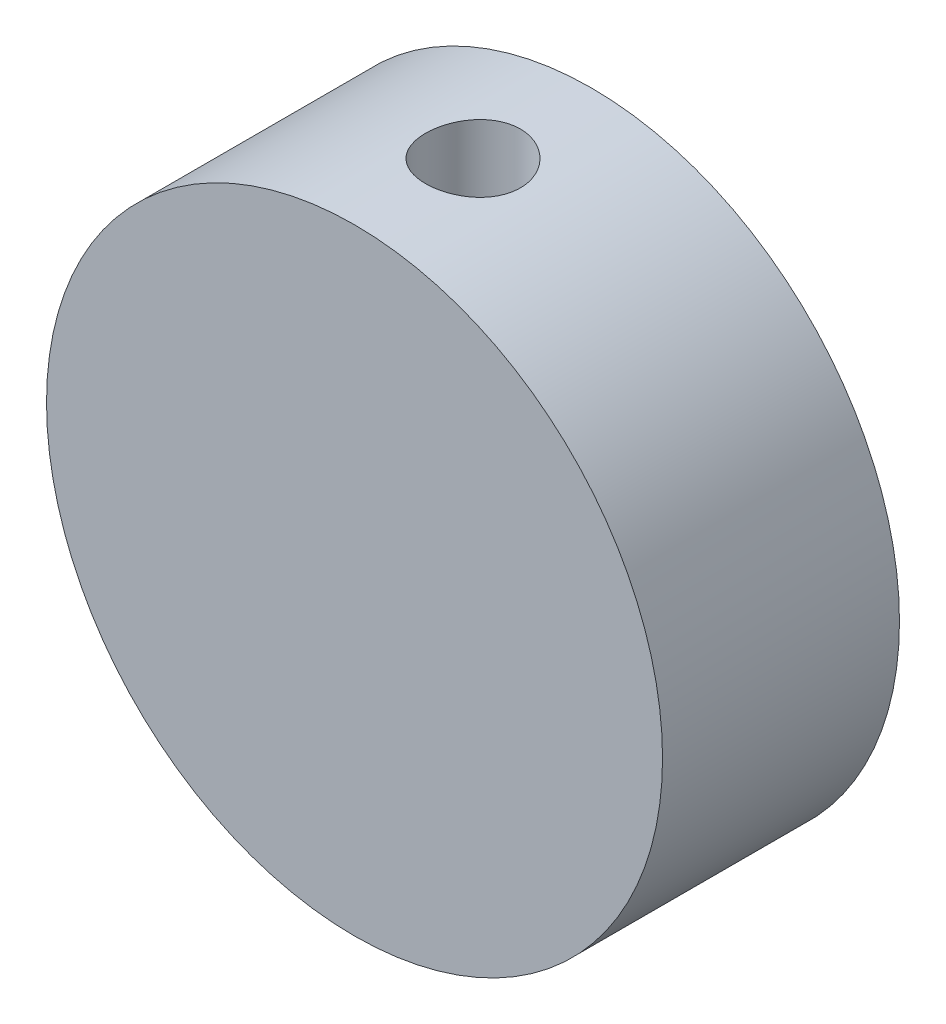
ISO-10303-21;
HEADER;
FILE_DESCRIPTION(('STEP AP214'),'2;1');
FILE_NAME('part.step','',(''),(''),'','','');
FILE_SCHEMA(('AUTOMOTIVE_DESIGN { 1 0 10303 214 1 1 1 1 }'));
ENDSEC;
DATA;
#1=APPLICATION_CONTEXT('core data for automotive mechanical design processes');
#2=APPLICATION_PROTOCOL_DEFINITION('international standard','automotive_design',2000,#1);
#3=PRODUCT_CONTEXT('',#1,'mechanical');
#4=PRODUCT('Part','Part','',(#3));
#5=PRODUCT_RELATED_PRODUCT_CATEGORY('part','',(#4));
#6=PRODUCT_DEFINITION_FORMATION('','',#4);
#7=PRODUCT_DEFINITION_CONTEXT('part definition',#1,'design');
#8=PRODUCT_DEFINITION('design','',#6,#7);
#9=PRODUCT_DEFINITION_SHAPE('','',#8);
#10=(LENGTH_UNIT() NAMED_UNIT(*) SI_UNIT(.MILLI.,.METRE.));
#11=(NAMED_UNIT(*) PLANE_ANGLE_UNIT() SI_UNIT($,.RADIAN.));
#12=(NAMED_UNIT(*) SI_UNIT($,.STERADIAN.) SOLID_ANGLE_UNIT());
#13=UNCERTAINTY_MEASURE_WITH_UNIT(LENGTH_MEASURE(1.E-05),#10,'distance_accuracy_value','');
#14=(GEOMETRIC_REPRESENTATION_CONTEXT(3) GLOBAL_UNCERTAINTY_ASSIGNED_CONTEXT((#13)) GLOBAL_UNIT_ASSIGNED_CONTEXT((#10,
#11,#12)) REPRESENTATION_CONTEXT('',''));
#15=CARTESIAN_POINT('',(0.,0.,0.));
#16=DIRECTION('',(0.,0.,1.));
#17=DIRECTION('',(1.,0.,0.));
#18=AXIS2_PLACEMENT_3D('',#15,#16,#17);
#19=CARTESIAN_POINT('',(0.,0.,10.));
#20=DIRECTION('',(0.,0.,-1.));
#21=DIRECTION('',(-1.,0.,0.));
#22=AXIS2_PLACEMENT_3D('',#19,#20,#21);
#23=CYLINDRICAL_SURFACE('',#22,26.);
#24=CARTESIAN_POINT('',(0.,0.,10.));
#25=DIRECTION('',(0.,0.,1.));
#26=DIRECTION('',(1.,0.,0.));
#27=AXIS2_PLACEMENT_3D('',#24,#25,#26);
#28=CIRCLE('',#27,26.);
#29=CARTESIAN_POINT('',(26.,0.,10.));
#30=VERTEX_POINT('',#29);
#31=EDGE_CURVE('E10',#30,#30,#28,.T.);
#32=ORIENTED_EDGE('',*,*,#31,.F.);
#33=EDGE_LOOP('',(#32));
#34=FACE_BOUND('',#33,.T.);
#35=CARTESIAN_POINT('',(0.,0.,-10.));
#36=DIRECTION('',(0.,0.,1.));
#37=DIRECTION('',(1.,0.,0.));
#38=AXIS2_PLACEMENT_3D('',#35,#36,#37);
#39=CIRCLE('',#38,26.);
#40=CARTESIAN_POINT('',(26.,0.,-10.));
#41=VERTEX_POINT('',#40);
#42=EDGE_CURVE('E51',#41,#41,#39,.T.);
#43=ORIENTED_EDGE('',*,*,#42,.T.);
#44=EDGE_LOOP('',(#43));
#45=FACE_BOUND('',#44,.T.);
#46=CARTESIAN_POINT('',(0.,-26.,-4.));
#47=CARTESIAN_POINT('',(0.223268258919544,-25.9999963596867,-3.99999084600665));
#48=CARTESIAN_POINT('',(0.446664365858241,-25.997094013731,-3.9812436147341));
#49=CARTESIAN_POINT('',(0.887207599296014,-25.9857953425572,-3.90677170724693));
#50=CARTESIAN_POINT('',(1.10434850645339,-25.9773937339279,-3.8510114700955));
#51=CARTESIAN_POINT('',(1.52594244353405,-25.9560402900715,-3.70422311066313));
#52=CARTESIAN_POINT('',(1.73040509885833,-25.943091957767,-3.61322213329454));
#53=CARTESIAN_POINT('',(2.12112834108418,-25.9140742793853,-3.3986028900971));
#54=CARTESIAN_POINT('',(2.30739135188758,-25.8980053497758,-3.27498897592673));
#55=CARTESIAN_POINT('',(2.65798554404949,-25.8643848062391,-2.99757309257999));
#56=CARTESIAN_POINT('',(2.82214584292422,-25.846823181814,-2.8435563549047));
#57=CARTESIAN_POINT('',(3.12239996474998,-25.8122745182759,-2.51016899674329));
#58=CARTESIAN_POINT('',(3.2584921396486,-25.7952875129512,-2.33079688852882));
#59=CARTESIAN_POINT('',(3.49941648468099,-25.7637143392372,-1.95063655442827));
#60=CARTESIAN_POINT('',(3.60408250060098,-25.749141108396,-1.74974186146981));
#61=CARTESIAN_POINT('',(3.77812146651632,-25.7241827074652,-1.33296224186927));
#62=CARTESIAN_POINT('',(3.84749644119145,-25.7137972971235,-1.11707817598922));
#63=CARTESIAN_POINT('',(3.94845158264723,-25.6984891152596,-0.678248418090942));
#64=CARTESIAN_POINT('',(3.98032486951551,-25.6935240000787,-0.455371664229691));
#65=CARTESIAN_POINT('',(4.00628009862968,-25.6894901311625,-0.00738214019056947));
#66=CARTESIAN_POINT('',(4.00036432204971,-25.6904210215091,0.217730494197084));
#67=CARTESIAN_POINT('',(3.95114871924729,-25.698035277325,0.661726207326923));
#68=CARTESIAN_POINT('',(3.90817597776659,-25.704668311018,0.880646530219731));
#69=CARTESIAN_POINT('',(3.78657858788964,-25.7228608174013,1.30813216452883));
#70=CARTESIAN_POINT('',(3.7079528831081,-25.7344204360642,1.51669716891736));
#71=CARTESIAN_POINT('',(3.51694318033613,-25.7612189583524,1.9185433954021));
#72=CARTESIAN_POINT('',(3.4044212432196,-25.7764728449355,2.11175801068991));
#73=CARTESIAN_POINT('',(3.14891132949644,-25.8089304414476,2.4766874986709));
#74=CARTESIAN_POINT('',(3.00592125116442,-25.8261342858485,2.64840088688817));
#75=CARTESIAN_POINT('',(2.691741548219,-25.8607754702424,2.96734875448531));
#76=CARTESIAN_POINT('',(2.52027083449741,-25.878213361352,3.11430642814779));
#77=CARTESIAN_POINT('',(2.15495367146246,-25.9111897616538,3.37740180766206));
#78=CARTESIAN_POINT('',(1.96110711474102,-25.9267282617279,3.49353936556292));
#79=CARTESIAN_POINT('',(1.55629641844375,-25.954172581816,3.69171445038169));
#80=CARTESIAN_POINT('',(1.34532131852673,-25.9660760522556,3.77372993416853));
#81=CARTESIAN_POINT('',(0.912368163381505,-25.984889657892,3.90108851348724));
#82=CARTESIAN_POINT('',(0.690390892225507,-25.9918001483695,3.94643421832252));
#83=CARTESIAN_POINT('',(0.244122827312598,-25.999801955218,3.99879637635844));
#84=CARTESIAN_POINT('',(0.0198776682966373,-26.000951025772,4.00619325733188));
#85=CARTESIAN_POINT('',(-0.426650117385462,-25.9974579515693,3.98345856079156));
#86=CARTESIAN_POINT('',(-0.648932807821428,-25.992815995693,3.95332820726782));
#87=CARTESIAN_POINT('',(-1.08406849699302,-25.9782981675713,3.85671069878224));
#88=CARTESIAN_POINT('',(-1.29696376745792,-25.9684490809292,3.79040955206752));
#89=CARTESIAN_POINT('',(-1.70861657587935,-25.9446175479383,3.62352913127572));
#90=CARTESIAN_POINT('',(-1.90737341971293,-25.9306348988265,3.52294817564089));
#91=CARTESIAN_POINT('',(-2.28677571830288,-25.8999459953333,3.28947546642709));
#92=CARTESIAN_POINT('',(-2.46727152998573,-25.88321978786,3.15634320848975));
#93=CARTESIAN_POINT('',(-2.80349479037047,-25.8489657683653,2.86188098116183));
#94=CARTESIAN_POINT('',(-2.95922071948856,-25.8314379072489,2.70054928306417));
#95=CARTESIAN_POINT('',(-3.24287374354124,-25.7973721390744,2.35257133810133));
#96=CARTESIAN_POINT('',(-3.37054536508261,-25.7808442492966,2.16571571189185));
#97=CARTESIAN_POINT('',(-3.59268800750509,-25.7508293219053,1.77298724709684));
#98=CARTESIAN_POINT('',(-3.68715996156216,-25.7373421988259,1.56711494323736));
#99=CARTESIAN_POINT('',(-3.83982866441722,-25.7150089816407,1.14294833003054));
#100=CARTESIAN_POINT('',(-3.89815823564972,-25.706145913451,0.924702760316922));
#101=CARTESIAN_POINT('',(-3.97730814489418,-25.6940197419908,0.481365975593617));
#102=CARTESIAN_POINT('',(-3.99813122006596,-25.6907562300751,0.256275261350075));
#103=CARTESIAN_POINT('',(-4.00160942914073,-25.6902144659764,-0.191814940490921));
#104=CARTESIAN_POINT('',(-3.98466634184938,-25.6928732091284,-0.414811336670195));
#105=CARTESIAN_POINT('',(-3.91395589615308,-25.703739197113,-0.85474242010821));
#106=CARTESIAN_POINT('',(-3.86018860925912,-25.7119464311705,-1.07167711913765));
#107=CARTESIAN_POINT('',(-3.71750076417239,-25.7329621976885,-1.49320568247525));
#108=CARTESIAN_POINT('',(-3.62860974071582,-25.7457668634509,-1.69780974915814));
#109=CARTESIAN_POINT('',(-3.41823794353161,-25.7745392088067,-2.08926533796223));
#110=CARTESIAN_POINT('',(-3.29675595115962,-25.7905070066702,-2.27611619590004));
#111=CARTESIAN_POINT('',(-3.02319660080708,-25.8240083993195,-2.62880019428814));
#112=CARTESIAN_POINT('',(-2.87082209181514,-25.8415562031987,-2.79440152793741));
#113=CARTESIAN_POINT('',(-2.54043103197271,-25.8761229752395,-3.09782552392538));
#114=CARTESIAN_POINT('',(-2.36240854021089,-25.8931418197635,-3.23564173252577));
#115=CARTESIAN_POINT('',(-1.98455544459365,-25.9248464175596,-3.48030242822366));
#116=CARTESIAN_POINT('',(-1.78460419907219,-25.9395180480202,-3.58696240678475));
#117=CARTESIAN_POINT('',(-1.36949025363774,-25.9647369659664,-3.7650229268567));
#118=CARTESIAN_POINT('',(-1.15434343581349,-25.9752884865267,-3.83645967728196));
#119=CARTESIAN_POINT('',(-0.781882800138171,-25.9886931456243,-3.92599427493878));
#120=CARTESIAN_POINT('',(-0.626858350653035,-25.9929112444029,-3.95370356292003));
#121=CARTESIAN_POINT('',(-0.314577072788732,-25.998565935461,-3.99070952701382));
#122=CARTESIAN_POINT('',(-0.157320274384946,-26.0000025650538,-4.00000645012754));
#123=CARTESIAN_POINT('',(0.,-26.,-4.));
#124=B_SPLINE_CURVE_WITH_KNOTS('',3,(#46,#47,#48,#49,#50,#51,#52,#53,#54,#55,#56,#57,#58,#59,
#60,#61,#62,#63,#64,#65,#66,#67,#68,#69,#70,#71,#72,#73,#74,#75,#76,#77,#78,#79,#80,#81,#82,#83,
#84,#85,#86,#87,#88,#89,#90,#91,#92,#93,#94,#95,#96,#97,#98,#99,#100,#101,#102,#103,#104,#105,
#106,#107,#108,#109,#110,#111,#112,#113,#114,#115,#116,#117,#118,#119,#120,#121,#122,#123),
.UNSPECIFIED.,.T.,.F.,(4,2,2,2,2,2,2,2,2,2,2,2,2,2,2,2,2,2,2,2,2,2,2,2,2,2,2,2,2,2,2,2,2,2,2,2,
2,2,4),(0.,0.669229870805508,1.33910364915791,2.00846246635071,2.67773201378231,
3.35191041320841,4.0261283865374,4.70385068916707,5.38153410585291,6.05388467435893,
6.72619465614244,7.39263050926031,8.05908610993845,8.7282913237069,9.39754271492908,
10.073841396486,10.7501433245337,11.4268814731494,12.1035714630187,12.7734643566856,
13.4433354016669,14.1097936694649,14.7762846343353,15.4478572108893,16.1194709712289,
16.7969681906896,17.474446365541,18.1494198231187,18.8243440202937,19.4921222805424,
20.1598992439985,20.8271158801754,21.494357468453,22.1683507689167,22.8425004400178,
23.5205650724231,24.1979312044067,24.6694932608,25.1410489911632),.UNSPECIFIED.);
#125=CARTESIAN_POINT('',(0.,-26.,-4.));
#126=VERTEX_POINT('',#125);
#127=EDGE_CURVE('E57',#126,#126,#124,.T.);
#128=ORIENTED_EDGE('',*,*,#127,.F.);
#129=EDGE_LOOP('',(#128));
#130=FACE_BOUND('',#129,.T.);
#131=CARTESIAN_POINT('',(0.,26.,-4.));
#132=CARTESIAN_POINT('',(-0.223268258919544,25.9999963596867,-3.99999084600665));
#133=CARTESIAN_POINT('',(-0.446664365858241,25.997094013731,-3.9812436147341));
#134=CARTESIAN_POINT('',(-0.887207599296014,25.9857953425572,-3.90677170724693));
#135=CARTESIAN_POINT('',(-1.10434850645339,25.9773937339279,-3.8510114700955));
#136=CARTESIAN_POINT('',(-1.52594244353405,25.9560402900715,-3.70422311066313));
#137=CARTESIAN_POINT('',(-1.73040509885833,25.943091957767,-3.61322213329454));
#138=CARTESIAN_POINT('',(-2.12112834108418,25.9140742793853,-3.3986028900971));
#139=CARTESIAN_POINT('',(-2.30739135188758,25.8980053497758,-3.27498897592673));
#140=CARTESIAN_POINT('',(-2.65798554404949,25.8643848062391,-2.99757309257999));
#141=CARTESIAN_POINT('',(-2.82214584292422,25.846823181814,-2.8435563549047));
#142=CARTESIAN_POINT('',(-3.12239996474998,25.8122745182759,-2.51016899674329));
#143=CARTESIAN_POINT('',(-3.2584921396486,25.7952875129512,-2.33079688852882));
#144=CARTESIAN_POINT('',(-3.49941648468099,25.7637143392372,-1.95063655442827));
#145=CARTESIAN_POINT('',(-3.60408250060098,25.749141108396,-1.74974186146981));
#146=CARTESIAN_POINT('',(-3.77812146651632,25.7241827074652,-1.33296224186927));
#147=CARTESIAN_POINT('',(-3.84749644119145,25.7137972971235,-1.11707817598922));
#148=CARTESIAN_POINT('',(-3.94845158264723,25.6984891152596,-0.678248418090942));
#149=CARTESIAN_POINT('',(-3.98032486951551,25.6935240000787,-0.455371664229691));
#150=CARTESIAN_POINT('',(-4.00628009862968,25.6894901311625,-0.00738214019056947));
#151=CARTESIAN_POINT('',(-4.00036432204971,25.6904210215091,0.217730494197084));
#152=CARTESIAN_POINT('',(-3.95114871924729,25.698035277325,0.661726207326923));
#153=CARTESIAN_POINT('',(-3.90817597776659,25.704668311018,0.880646530219731));
#154=CARTESIAN_POINT('',(-3.78657858788964,25.7228608174013,1.30813216452883));
#155=CARTESIAN_POINT('',(-3.7079528831081,25.7344204360642,1.51669716891736));
#156=CARTESIAN_POINT('',(-3.51694318033613,25.7612189583524,1.9185433954021));
#157=CARTESIAN_POINT('',(-3.4044212432196,25.7764728449355,2.11175801068991));
#158=CARTESIAN_POINT('',(-3.14891132949644,25.8089304414476,2.4766874986709));
#159=CARTESIAN_POINT('',(-3.00592125116442,25.8261342858485,2.64840088688817));
#160=CARTESIAN_POINT('',(-2.691741548219,25.8607754702424,2.96734875448531));
#161=CARTESIAN_POINT('',(-2.52027083449741,25.878213361352,3.11430642814779));
#162=CARTESIAN_POINT('',(-2.15495367146246,25.9111897616538,3.37740180766206));
#163=CARTESIAN_POINT('',(-1.96110711474102,25.9267282617279,3.49353936556292));
#164=CARTESIAN_POINT('',(-1.55629641844375,25.954172581816,3.69171445038169));
#165=CARTESIAN_POINT('',(-1.34532131852673,25.9660760522556,3.77372993416853));
#166=CARTESIAN_POINT('',(-0.912368163381505,25.984889657892,3.90108851348724));
#167=CARTESIAN_POINT('',(-0.690390892225507,25.9918001483695,3.94643421832252));
#168=CARTESIAN_POINT('',(-0.244122827312598,25.999801955218,3.99879637635844));
#169=CARTESIAN_POINT('',(-0.0198776682966373,26.000951025772,4.00619325733188));
#170=CARTESIAN_POINT('',(0.426650117385462,25.9974579515693,3.98345856079156));
#171=CARTESIAN_POINT('',(0.648932807821428,25.992815995693,3.95332820726782));
#172=CARTESIAN_POINT('',(1.08406849699302,25.9782981675713,3.85671069878224));
#173=CARTESIAN_POINT('',(1.29696376745792,25.9684490809292,3.79040955206752));
#174=CARTESIAN_POINT('',(1.70861657587935,25.9446175479383,3.62352913127572));
#175=CARTESIAN_POINT('',(1.90737341971293,25.9306348988265,3.52294817564089));
#176=CARTESIAN_POINT('',(2.28677571830288,25.8999459953333,3.28947546642709));
#177=CARTESIAN_POINT('',(2.46727152998573,25.88321978786,3.15634320848975));
#178=CARTESIAN_POINT('',(2.80349479037047,25.8489657683653,2.86188098116183));
#179=CARTESIAN_POINT('',(2.95922071948856,25.8314379072489,2.70054928306417));
#180=CARTESIAN_POINT('',(3.24287374354124,25.7973721390744,2.35257133810133));
#181=CARTESIAN_POINT('',(3.37054536508261,25.7808442492966,2.16571571189185));
#182=CARTESIAN_POINT('',(3.59268800750509,25.7508293219053,1.77298724709684));
#183=CARTESIAN_POINT('',(3.68715996156216,25.7373421988259,1.56711494323736));
#184=CARTESIAN_POINT('',(3.83982866441722,25.7150089816407,1.14294833003054));
#185=CARTESIAN_POINT('',(3.89815823564972,25.706145913451,0.924702760316922));
#186=CARTESIAN_POINT('',(3.97730814489418,25.6940197419908,0.481365975593617));
#187=CARTESIAN_POINT('',(3.99813122006596,25.6907562300751,0.256275261350075));
#188=CARTESIAN_POINT('',(4.00160942914073,25.6902144659764,-0.191814940490921));
#189=CARTESIAN_POINT('',(3.98466634184938,25.6928732091284,-0.414811336670195));
#190=CARTESIAN_POINT('',(3.91395589615308,25.703739197113,-0.85474242010821));
#191=CARTESIAN_POINT('',(3.86018860925912,25.7119464311705,-1.07167711913765));
#192=CARTESIAN_POINT('',(3.71750076417239,25.7329621976885,-1.49320568247525));
#193=CARTESIAN_POINT('',(3.62860974071582,25.7457668634509,-1.69780974915814));
#194=CARTESIAN_POINT('',(3.41823794353161,25.7745392088067,-2.08926533796223));
#195=CARTESIAN_POINT('',(3.29675595115962,25.7905070066702,-2.27611619590004));
#196=CARTESIAN_POINT('',(3.02319660080708,25.8240083993195,-2.62880019428814));
#197=CARTESIAN_POINT('',(2.87082209181514,25.8415562031987,-2.79440152793741));
#198=CARTESIAN_POINT('',(2.54043103197271,25.8761229752395,-3.09782552392538));
#199=CARTESIAN_POINT('',(2.36240854021089,25.8931418197635,-3.23564173252577));
#200=CARTESIAN_POINT('',(1.98455544459365,25.9248464175596,-3.48030242822366));
#201=CARTESIAN_POINT('',(1.78460419907219,25.9395180480202,-3.58696240678475));
#202=CARTESIAN_POINT('',(1.36949025363774,25.9647369659664,-3.7650229268567));
#203=CARTESIAN_POINT('',(1.15434343581349,25.9752884865267,-3.83645967728196));
#204=CARTESIAN_POINT('',(0.781882800138171,25.9886931456243,-3.92599427493878));
#205=CARTESIAN_POINT('',(0.626858350653035,25.9929112444029,-3.95370356292003));
#206=CARTESIAN_POINT('',(0.314577072788732,25.998565935461,-3.99070952701382));
#207=CARTESIAN_POINT('',(0.157320274384946,26.0000025650538,-4.00000645012754));
#208=CARTESIAN_POINT('',(0.,26.,-4.));
#209=B_SPLINE_CURVE_WITH_KNOTS('',3,(#131,#132,#133,#134,#135,#136,#137,#138,#139,#140,#141,
#142,#143,#144,#145,#146,#147,#148,#149,#150,#151,#152,#153,#154,#155,#156,#157,#158,#159,#160,
#161,#162,#163,#164,#165,#166,#167,#168,#169,#170,#171,#172,#173,#174,#175,#176,#177,#178,#179,
#180,#181,#182,#183,#184,#185,#186,#187,#188,#189,#190,#191,#192,#193,#194,#195,#196,#197,#198,
#199,#200,#201,#202,#203,#204,#205,#206,#207,#208),.UNSPECIFIED.,.T.,.F.,(4,2,2,2,2,2,2,2,2,2,2,
2,2,2,2,2,2,2,2,2,2,2,2,2,2,2,2,2,2,2,2,2,2,2,2,2,2,2,4),(0.,0.669229870805508,1.33910364915791,
2.00846246635071,2.67773201378231,3.35191041320841,4.0261283865374,4.70385068916707,
5.38153410585291,6.05388467435893,6.72619465614244,7.39263050926031,8.05908610993845,
8.7282913237069,9.39754271492908,10.073841396486,10.7501433245337,11.4268814731494,
12.1035714630187,12.7734643566856,13.4433354016669,14.1097936694649,14.7762846343353,
15.4478572108893,16.1194709712289,16.7969681906896,17.474446365541,18.1494198231187,
18.8243440202937,19.4921222805424,20.1598992439985,20.8271158801754,21.494357468453,
22.1683507689167,22.8425004400178,23.5205650724231,24.1979312044067,24.6694932608,
25.1410489911632),.UNSPECIFIED.);
#210=CARTESIAN_POINT('',(0.,26.,-4.));
#211=VERTEX_POINT('',#210);
#212=EDGE_CURVE('E43',#211,#211,#209,.T.);
#213=ORIENTED_EDGE('',*,*,#212,.F.);
#214=EDGE_LOOP('',(#213));
#215=FACE_BOUND('',#214,.T.);
#216=ADVANCED_FACE('F39',(#34,#45,#130,#215),#23,.T.);
#217=CARTESIAN_POINT('',(0.,0.,10.));
#218=DIRECTION('',(0.,0.,1.));
#219=DIRECTION('',(1.,0.,0.));
#220=AXIS2_PLACEMENT_3D('',#217,#218,#219);
#221=PLANE('',#220);
#222=ORIENTED_EDGE('',*,*,#31,.T.);
#223=EDGE_LOOP('',(#222));
#224=FACE_BOUND('',#223,.T.);
#225=ADVANCED_FACE('F68',(#224),#221,.T.);
#226=CARTESIAN_POINT('',(0.,0.,-10.));
#227=DIRECTION('',(0.,0.,1.));
#228=DIRECTION('',(1.,0.,0.));
#229=AXIS2_PLACEMENT_3D('',#226,#227,#228);
#230=PLANE('',#229);
#231=ORIENTED_EDGE('',*,*,#42,.F.);
#232=EDGE_LOOP('',(#231));
#233=FACE_BOUND('',#232,.T.);
#234=ADVANCED_FACE('F66',(#233),#230,.F.);
#235=CARTESIAN_POINT('',(0.,40.,0.));
#236=DIRECTION('',(0.,-1.,0.));
#237=DIRECTION('',(0.,0.,-1.));
#238=AXIS2_PLACEMENT_3D('',#235,#236,#237);
#239=CYLINDRICAL_SURFACE('',#238,4.);
#240=ORIENTED_EDGE('',*,*,#127,.T.);
#241=EDGE_LOOP('',(#240));
#242=FACE_BOUND('',#241,.T.);
#243=ORIENTED_EDGE('',*,*,#212,.T.);
#244=EDGE_LOOP('',(#243));
#245=FACE_BOUND('',#244,.T.);
#246=ADVANCED_FACE('F62',(#242,#245),#239,.F.);
#247=CLOSED_SHELL('',(#216,#225,#234,#246));
#248=MANIFOLD_SOLID_BREP('B2',#247);
#249=ADVANCED_BREP_SHAPE_REPRESENTATION('',(#18,#248),#14);
#250=SHAPE_DEFINITION_REPRESENTATION(#9,#249);
ENDSEC;
END-ISO-10303-21;
